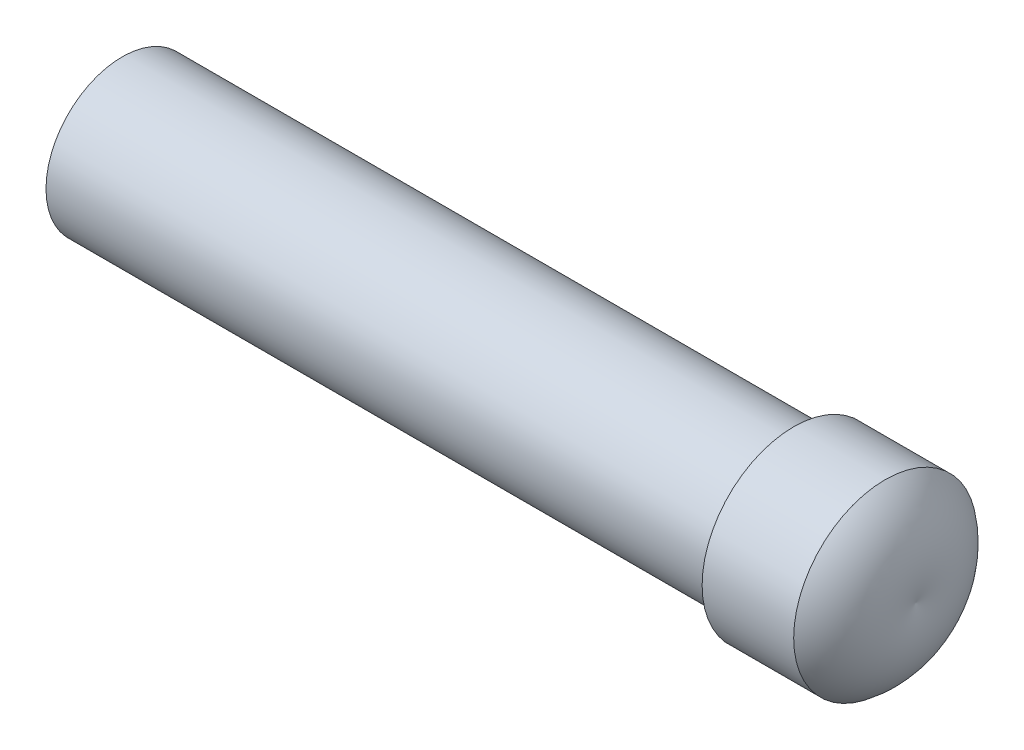
ISO-10303-21;
HEADER;
FILE_DESCRIPTION(('STEP AP214'),'2;1');
FILE_NAME('part.step','',(''),(''),'','','');
FILE_SCHEMA(('AUTOMOTIVE_DESIGN { 1 0 10303 214 1 1 1 1 }'));
ENDSEC;
DATA;
#1=APPLICATION_CONTEXT('core data for automotive mechanical design processes');
#2=APPLICATION_PROTOCOL_DEFINITION('international standard','automotive_design',2000,#1);
#3=PRODUCT_CONTEXT('',#1,'mechanical');
#4=PRODUCT('Part','Part','',(#3));
#5=PRODUCT_RELATED_PRODUCT_CATEGORY('part','',(#4));
#6=PRODUCT_DEFINITION_FORMATION('','',#4);
#7=PRODUCT_DEFINITION_CONTEXT('part definition',#1,'design');
#8=PRODUCT_DEFINITION('design','',#6,#7);
#9=PRODUCT_DEFINITION_SHAPE('','',#8);
#10=(LENGTH_UNIT() NAMED_UNIT(*) SI_UNIT(.MILLI.,.METRE.));
#11=(NAMED_UNIT(*) PLANE_ANGLE_UNIT() SI_UNIT($,.RADIAN.));
#12=(NAMED_UNIT(*) SI_UNIT($,.STERADIAN.) SOLID_ANGLE_UNIT());
#13=UNCERTAINTY_MEASURE_WITH_UNIT(LENGTH_MEASURE(1.E-05),#10,'distance_accuracy_value','');
#14=(GEOMETRIC_REPRESENTATION_CONTEXT(3) GLOBAL_UNCERTAINTY_ASSIGNED_CONTEXT((#13)) GLOBAL_UNIT_ASSIGNED_CONTEXT((#10,
#11,#12)) REPRESENTATION_CONTEXT('',''));
#15=CARTESIAN_POINT('',(0.,0.,0.));
#16=DIRECTION('',(0.,0.,1.));
#17=DIRECTION('',(1.,0.,0.));
#18=AXIS2_PLACEMENT_3D('',#15,#16,#17);
#19=CARTESIAN_POINT('',(0.,0.,0.));
#20=DIRECTION('',(1.,0.,0.));
#21=DIRECTION('',(0.,0.,-1.));
#22=AXIS2_PLACEMENT_3D('',#19,#20,#21);
#23=PLANE('',#22);
#24=CARTESIAN_POINT('',(0.,0.,0.));
#25=DIRECTION('',(-1.,0.,0.));
#26=DIRECTION('',(0.,0.,1.));
#27=AXIS2_PLACEMENT_3D('',#24,#25,#26);
#28=CIRCLE('',#27,12.5);
#29=CARTESIAN_POINT('',(0.,0.,12.5));
#30=VERTEX_POINT('',#29);
#31=EDGE_CURVE('E11',#30,#30,#28,.T.);
#32=ORIENTED_EDGE('',*,*,#31,.T.);
#33=EDGE_LOOP('',(#32));
#34=FACE_BOUND('',#33,.T.);
#35=ADVANCED_FACE('F33',(#34),#23,.F.);
#36=CARTESIAN_POINT('',(0.,0.,0.));
#37=DIRECTION('',(-1.,0.,0.));
#38=DIRECTION('',(0.,0.,1.));
#39=AXIS2_PLACEMENT_3D('',#36,#37,#38);
#40=CYLINDRICAL_SURFACE('',#39,12.5);
#41=ORIENTED_EDGE('',*,*,#31,.F.);
#42=EDGE_LOOP('',(#41));
#43=FACE_BOUND('',#42,.T.);
#44=CARTESIAN_POINT('',(110.,0.,0.));
#45=DIRECTION('',(-1.,0.,0.));
#46=DIRECTION('',(0.,0.,1.));
#47=AXIS2_PLACEMENT_3D('',#44,#45,#46);
#48=CIRCLE('',#47,12.5);
#49=CARTESIAN_POINT('',(110.,0.,12.5));
#50=VERTEX_POINT('',#49);
#51=EDGE_CURVE('E39',#50,#50,#48,.T.);
#52=ORIENTED_EDGE('',*,*,#51,.T.);
#53=EDGE_LOOP('',(#52));
#54=FACE_BOUND('',#53,.T.);
#55=ADVANCED_FACE('F55',(#43,#54),#40,.T.);
#56=CARTESIAN_POINT('',(110.,12.5,0.));
#57=DIRECTION('',(1.,0.,0.));
#58=DIRECTION('',(0.,0.,-1.));
#59=AXIS2_PLACEMENT_3D('',#56,#57,#58);
#60=PLANE('',#59);
#61=ORIENTED_EDGE('',*,*,#51,.F.);
#62=EDGE_LOOP('',(#61));
#63=FACE_BOUND('',#62,.T.);
#64=CARTESIAN_POINT('',(110.,0.,0.));
#65=DIRECTION('',(-1.,0.,0.));
#66=DIRECTION('',(0.,0.,1.));
#67=AXIS2_PLACEMENT_3D('',#64,#65,#66);
#68=CIRCLE('',#67,15.);
#69=CARTESIAN_POINT('',(110.,0.,15.));
#70=VERTEX_POINT('',#69);
#71=EDGE_CURVE('E66',#70,#70,#68,.T.);
#72=ORIENTED_EDGE('',*,*,#71,.T.);
#73=EDGE_LOOP('',(#72));
#74=FACE_BOUND('',#73,.T.);
#75=ADVANCED_FACE('F50',(#63,#74),#60,.F.);
#76=CARTESIAN_POINT('',(0.,0.,0.));
#77=DIRECTION('',(-1.,0.,0.));
#78=DIRECTION('',(0.,0.,1.));
#79=AXIS2_PLACEMENT_3D('',#76,#77,#78);
#80=CYLINDRICAL_SURFACE('',#79,15.);
#81=ORIENTED_EDGE('',*,*,#71,.F.);
#82=EDGE_LOOP('',(#81));
#83=FACE_BOUND('',#82,.T.);
#84=CARTESIAN_POINT('',(125.,0.,0.));
#85=DIRECTION('',(-1.,0.,0.));
#86=DIRECTION('',(0.,0.,1.));
#87=AXIS2_PLACEMENT_3D('',#84,#85,#86);
#88=CIRCLE('',#87,15.);
#89=CARTESIAN_POINT('',(125.,0.,15.));
#90=VERTEX_POINT('',#89);
#91=EDGE_CURVE('E68',#90,#90,#88,.T.);
#92=ORIENTED_EDGE('',*,*,#91,.T.);
#93=EDGE_LOOP('',(#92));
#94=FACE_BOUND('',#93,.T.);
#95=ADVANCED_FACE('F44',(#83,#94),#80,.T.);
#96=CARTESIAN_POINT('',(116.908832788249,0.,3.96961092941634));
#97=DIRECTION('',(0.,-1.,0.));
#98=DIRECTION('',(0.,0.,1.));
#99=AXIS2_PLACEMENT_3D('',#96,#97,#98);
#100=CIRCLE('',#99,13.679783254751);
#101=TRIMMED_CURVE('',#100,(PARAMETER_VALUE(-1.86521212513415)),
(PARAMETER_VALUE(1.86521212513415)),.T.,.PARAMETER.);
#102=CARTESIAN_POINT('',(116.908832788249,0.,0.));
#103=DIRECTION('',(-1.,0.,0.));
#104=AXIS1_PLACEMENT('',#102,#103);
#105=SURFACE_OF_REVOLUTION('',#101,#104);
#106=ORIENTED_EDGE('',*,*,#91,.F.);
#107=EDGE_LOOP('',(#106));
#108=FACE_BOUND('',#107,.T.);
#109=CARTESIAN_POINT('',(130.,0.,0.));
#110=VERTEX_POINT('',#109);
#111=VERTEX_LOOP('',#110);
#112=FACE_BOUND('',#111,.T.);
#113=ADVANCED_FACE('F42',(#108,#112),#105,.T.);
#114=CLOSED_SHELL('',(#35,#55,#75,#95,#113));
#115=MANIFOLD_SOLID_BREP('B2',#114);
#116=ADVANCED_BREP_SHAPE_REPRESENTATION('',(#18,#115),#14);
#117=SHAPE_DEFINITION_REPRESENTATION(#9,#116);
ENDSEC;
END-ISO-10303-21;
